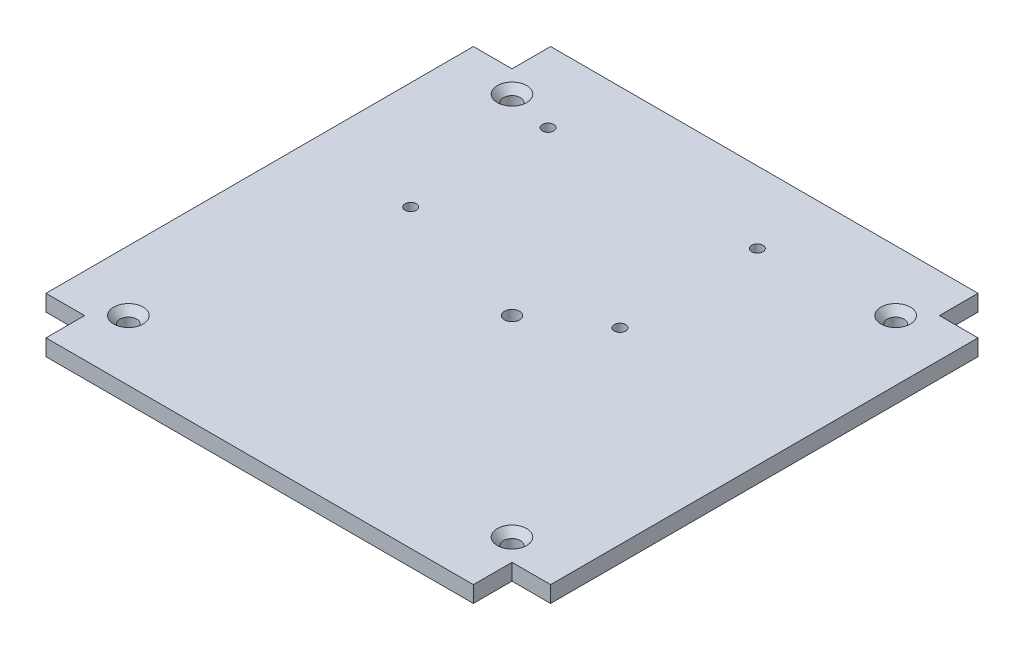
ISO-10303-21;
HEADER;
FILE_DESCRIPTION(('STEP AP214'),'2;1');
FILE_NAME('part.step','',(''),(''),'','','');
FILE_SCHEMA(('AUTOMOTIVE_DESIGN { 1 0 10303 214 1 1 1 1 }'));
ENDSEC;
DATA;
#1=APPLICATION_CONTEXT('core data for automotive mechanical design processes');
#2=APPLICATION_PROTOCOL_DEFINITION('international standard','automotive_design',2000,#1);
#3=PRODUCT_CONTEXT('',#1,'mechanical');
#4=PRODUCT('Part','Part','',(#3));
#5=PRODUCT_RELATED_PRODUCT_CATEGORY('part','',(#4));
#6=PRODUCT_DEFINITION_FORMATION('','',#4);
#7=PRODUCT_DEFINITION_CONTEXT('part definition',#1,'design');
#8=PRODUCT_DEFINITION('design','',#6,#7);
#9=PRODUCT_DEFINITION_SHAPE('','',#8);
#10=(LENGTH_UNIT() NAMED_UNIT(*) SI_UNIT(.MILLI.,.METRE.));
#11=(NAMED_UNIT(*) PLANE_ANGLE_UNIT() SI_UNIT($,.RADIAN.));
#12=(NAMED_UNIT(*) SI_UNIT($,.STERADIAN.) SOLID_ANGLE_UNIT());
#13=UNCERTAINTY_MEASURE_WITH_UNIT(LENGTH_MEASURE(1.E-05),#10,'distance_accuracy_value','');
#14=(GEOMETRIC_REPRESENTATION_CONTEXT(3) GLOBAL_UNCERTAINTY_ASSIGNED_CONTEXT((#13)) GLOBAL_UNIT_ASSIGNED_CONTEXT((#10,
#11,#12)) REPRESENTATION_CONTEXT('',''));
#15=CARTESIAN_POINT('',(0.,0.,0.));
#16=DIRECTION('',(0.,0.,1.));
#17=DIRECTION('',(1.,0.,0.));
#18=AXIS2_PLACEMENT_3D('',#15,#16,#17);
#19=CARTESIAN_POINT('',(49.,3.175,49.));
#20=DIRECTION('',(-1.,0.,0.));
#21=DIRECTION('',(0.,0.,1.));
#22=AXIS2_PLACEMENT_3D('',#19,#20,#21);
#23=PLANE('',#22);
#24=DIRECTION('',(0.,0.,-1.));
#25=VECTOR('',#24,1.);
#26=CARTESIAN_POINT('',(49.,3.175,49.));
#27=LINE('',#26,#25);
#28=CARTESIAN_POINT('',(49.,3.175,41.5));
#29=VERTEX_POINT('',#28);
#30=CARTESIAN_POINT('',(49.,3.175,-41.5));
#31=VERTEX_POINT('',#30);
#32=EDGE_CURVE('E161',#29,#31,#27,.T.);
#33=ORIENTED_EDGE('',*,*,#32,.F.);
#34=DIRECTION('',(0.,1.,0.));
#35=VECTOR('',#34,1.);
#36=CARTESIAN_POINT('',(49.,0.,41.5));
#37=LINE('',#36,#35);
#38=CARTESIAN_POINT('',(49.,0.,41.5));
#39=VERTEX_POINT('',#38);
#40=EDGE_CURVE('E235',#39,#29,#37,.T.);
#41=ORIENTED_EDGE('',*,*,#40,.F.);
#42=DIRECTION('',(0.,0.,-1.));
#43=VECTOR('',#42,1.);
#44=CARTESIAN_POINT('',(49.,0.,49.));
#45=LINE('',#44,#43);
#46=CARTESIAN_POINT('',(49.,0.,-41.5));
#47=VERTEX_POINT('',#46);
#48=EDGE_CURVE('E177',#39,#47,#45,.T.);
#49=ORIENTED_EDGE('',*,*,#48,.T.);
#50=DIRECTION('',(0.,1.,0.));
#51=VECTOR('',#50,1.);
#52=CARTESIAN_POINT('',(49.,0.,-41.5));
#53=LINE('',#52,#51);
#54=EDGE_CURVE('E209',#47,#31,#53,.T.);
#55=ORIENTED_EDGE('',*,*,#54,.T.);
#56=EDGE_LOOP('',(#33,#41,#49,#55));
#57=FACE_BOUND('',#56,.T.);
#58=ADVANCED_FACE('F41',(#57),#23,.F.);
#59=CARTESIAN_POINT('',(-49.,3.175,-49.));
#60=DIRECTION('',(0.,0.,1.));
#61=DIRECTION('',(1.,0.,0.));
#62=AXIS2_PLACEMENT_3D('',#59,#60,#61);
#63=PLANE('',#62);
#64=DIRECTION('',(-1.,0.,0.));
#65=VECTOR('',#64,1.);
#66=CARTESIAN_POINT('',(-49.,3.175,-49.));
#67=LINE('',#66,#65);
#68=CARTESIAN_POINT('',(41.5,3.175,-49.));
#69=VERTEX_POINT('',#68);
#70=CARTESIAN_POINT('',(-41.5,3.175,-49.));
#71=VERTEX_POINT('',#70);
#72=EDGE_CURVE('E165',#69,#71,#67,.T.);
#73=ORIENTED_EDGE('',*,*,#72,.F.);
#74=DIRECTION('',(0.,1.,0.));
#75=VECTOR('',#74,1.);
#76=CARTESIAN_POINT('',(41.5,0.,-49.));
#77=LINE('',#76,#75);
#78=CARTESIAN_POINT('',(41.5,0.,-49.));
#79=VERTEX_POINT('',#78);
#80=EDGE_CURVE('E201',#79,#69,#77,.T.);
#81=ORIENTED_EDGE('',*,*,#80,.F.);
#82=DIRECTION('',(-1.,0.,0.));
#83=VECTOR('',#82,1.);
#84=CARTESIAN_POINT('',(-49.,0.,-49.));
#85=LINE('',#84,#83);
#86=CARTESIAN_POINT('',(-41.5,0.,-49.));
#87=VERTEX_POINT('',#86);
#88=EDGE_CURVE('E169',#79,#87,#85,.T.);
#89=ORIENTED_EDGE('',*,*,#88,.T.);
#90=DIRECTION('',(0.,1.,0.));
#91=VECTOR('',#90,1.);
#92=CARTESIAN_POINT('',(-41.5,0.,-49.));
#93=LINE('',#92,#91);
#94=EDGE_CURVE('E181',#87,#71,#93,.T.);
#95=ORIENTED_EDGE('',*,*,#94,.T.);
#96=EDGE_LOOP('',(#73,#81,#89,#95));
#97=FACE_BOUND('',#96,.T.);
#98=ADVANCED_FACE('F376',(#97),#63,.F.);
#99=CARTESIAN_POINT('',(-49.,3.175,49.));
#100=DIRECTION('',(1.,0.,0.));
#101=DIRECTION('',(0.,0.,-1.));
#102=AXIS2_PLACEMENT_3D('',#99,#100,#101);
#103=PLANE('',#102);
#104=DIRECTION('',(0.,0.,1.));
#105=VECTOR('',#104,1.);
#106=CARTESIAN_POINT('',(-49.,0.,49.));
#107=LINE('',#106,#105);
#108=CARTESIAN_POINT('',(-49.,0.,-41.5));
#109=VERTEX_POINT('',#108);
#110=CARTESIAN_POINT('',(-49.,0.,41.5));
#111=VERTEX_POINT('',#110);
#112=EDGE_CURVE('E162',#109,#111,#107,.T.);
#113=ORIENTED_EDGE('',*,*,#112,.T.);
#114=DIRECTION('',(0.,1.,0.));
#115=VECTOR('',#114,1.);
#116=CARTESIAN_POINT('',(-49.,0.,41.5));
#117=LINE('',#116,#115);
#118=CARTESIAN_POINT('',(-49.,3.175,41.5));
#119=VERTEX_POINT('',#118);
#120=EDGE_CURVE('E248',#111,#119,#117,.T.);
#121=ORIENTED_EDGE('',*,*,#120,.T.);
#122=DIRECTION('',(0.,0.,1.));
#123=VECTOR('',#122,1.);
#124=CARTESIAN_POINT('',(-49.,3.175,49.));
#125=LINE('',#124,#123);
#126=CARTESIAN_POINT('',(-49.,3.175,-41.5));
#127=VERTEX_POINT('',#126);
#128=EDGE_CURVE('E50',#127,#119,#125,.T.);
#129=ORIENTED_EDGE('',*,*,#128,.F.);
#130=DIRECTION('',(0.,1.,0.));
#131=VECTOR('',#130,1.);
#132=CARTESIAN_POINT('',(-49.,0.,-41.5));
#133=LINE('',#132,#131);
#134=EDGE_CURVE('E187',#109,#127,#133,.T.);
#135=ORIENTED_EDGE('',*,*,#134,.F.);
#136=EDGE_LOOP('',(#113,#121,#129,#135));
#137=FACE_BOUND('',#136,.T.);
#138=ADVANCED_FACE('F365',(#137),#103,.F.);
#139=CARTESIAN_POINT('',(-49.,3.175,49.));
#140=DIRECTION('',(0.,0.,-1.));
#141=DIRECTION('',(-1.,0.,0.));
#142=AXIS2_PLACEMENT_3D('',#139,#140,#141);
#143=PLANE('',#142);
#144=DIRECTION('',(1.,0.,0.));
#145=VECTOR('',#144,1.);
#146=CARTESIAN_POINT('',(-49.,3.175,49.));
#147=LINE('',#146,#145);
#148=CARTESIAN_POINT('',(-41.5,3.175,49.));
#149=VERTEX_POINT('',#148);
#150=CARTESIAN_POINT('',(41.5,3.175,49.));
#151=VERTEX_POINT('',#150);
#152=EDGE_CURVE('E11',#149,#151,#147,.T.);
#153=ORIENTED_EDGE('',*,*,#152,.F.);
#154=DIRECTION('',(0.,1.,0.));
#155=VECTOR('',#154,1.);
#156=CARTESIAN_POINT('',(-41.5,0.,49.));
#157=LINE('',#156,#155);
#158=CARTESIAN_POINT('',(-41.5,0.,49.));
#159=VERTEX_POINT('',#158);
#160=EDGE_CURVE('E146',#159,#149,#157,.T.);
#161=ORIENTED_EDGE('',*,*,#160,.F.);
#162=DIRECTION('',(1.,0.,0.));
#163=VECTOR('',#162,1.);
#164=CARTESIAN_POINT('',(-49.,0.,49.));
#165=LINE('',#164,#163);
#166=CARTESIAN_POINT('',(41.5,0.,49.));
#167=VERTEX_POINT('',#166);
#168=EDGE_CURVE('E44',#159,#167,#165,.T.);
#169=ORIENTED_EDGE('',*,*,#168,.T.);
#170=DIRECTION('',(0.,1.,0.));
#171=VECTOR('',#170,1.);
#172=CARTESIAN_POINT('',(41.5,0.,49.));
#173=LINE('',#172,#171);
#174=EDGE_CURVE('E232',#167,#151,#173,.T.);
#175=ORIENTED_EDGE('',*,*,#174,.T.);
#176=EDGE_LOOP('',(#153,#161,#169,#175));
#177=FACE_BOUND('',#176,.T.);
#178=ADVANCED_FACE('F155',(#177),#143,.F.);
#179=CARTESIAN_POINT('',(0.,3.175,0.));
#180=DIRECTION('',(0.,-1.,0.));
#181=DIRECTION('',(0.,0.,-1.));
#182=AXIS2_PLACEMENT_3D('',#179,#180,#181);
#183=PLANE('',#182);
#184=CARTESIAN_POINT('',(37.2500000000016,3.175,37.250000000002));
#185=DIRECTION('',(0.,1.,0.));
#186=DIRECTION('',(0.,0.,1.));
#187=AXIS2_PLACEMENT_3D('',#184,#185,#186);
#188=CIRCLE('',#187,2.8575);
#189=CARTESIAN_POINT('',(37.2500000000016,3.175,40.107500000002));
#190=VERTEX_POINT('',#189);
#191=EDGE_CURVE('E334',#190,#190,#188,.T.);
#192=ORIENTED_EDGE('',*,*,#191,.F.);
#193=EDGE_LOOP('',(#192));
#194=FACE_BOUND('',#193,.T.);
#195=CARTESIAN_POINT('',(-37.2499999999981,3.175,37.2500000000024));
#196=DIRECTION('',(0.,1.,0.));
#197=DIRECTION('',(0.,0.,1.));
#198=AXIS2_PLACEMENT_3D('',#195,#196,#197);
#199=CIRCLE('',#198,2.8575);
#200=CARTESIAN_POINT('',(-37.2499999999981,3.175,40.1075000000024));
#201=VERTEX_POINT('',#200);
#202=EDGE_CURVE('E324',#201,#201,#199,.T.);
#203=ORIENTED_EDGE('',*,*,#202,.F.);
#204=EDGE_LOOP('',(#203));
#205=FACE_BOUND('',#204,.T.);
#206=CARTESIAN_POINT('',(-37.2499999999987,3.175,-37.2499999999978));
#207=DIRECTION('',(0.,1.,0.));
#208=DIRECTION('',(0.,0.,1.));
#209=AXIS2_PLACEMENT_3D('',#206,#207,#208);
#210=CIRCLE('',#209,2.8575);
#211=CARTESIAN_POINT('',(-37.2499999999987,3.175,-34.3924999999978));
#212=VERTEX_POINT('',#211);
#213=EDGE_CURVE('E315',#212,#212,#210,.T.);
#214=ORIENTED_EDGE('',*,*,#213,.F.);
#215=EDGE_LOOP('',(#214));
#216=FACE_BOUND('',#215,.T.);
#217=CARTESIAN_POINT('',(37.2499999999997,3.175,-37.2499999999999));
#218=DIRECTION('',(0.,1.,0.));
#219=DIRECTION('',(0.,0.,1.));
#220=AXIS2_PLACEMENT_3D('',#217,#218,#219);
#221=CIRCLE('',#220,2.8575);
#222=CARTESIAN_POINT('',(37.2499999999997,3.175,-34.3924999999999));
#223=VERTEX_POINT('',#222);
#224=EDGE_CURVE('E305',#223,#223,#221,.T.);
#225=ORIENTED_EDGE('',*,*,#224,.F.);
#226=EDGE_LOOP('',(#225));
#227=FACE_BOUND('',#226,.T.);
#228=CARTESIAN_POINT('',(-28.095,3.175,-35.095));
#229=DIRECTION('',(0.,1.,0.));
#230=DIRECTION('',(0.,0.,1.));
#231=AXIS2_PLACEMENT_3D('',#228,#229,#230);
#232=CIRCLE('',#231,1.1);
#233=CARTESIAN_POINT('',(-28.095,3.175,-33.995));
#234=VERTEX_POINT('',#233);
#235=EDGE_CURVE('E294',#234,#234,#232,.T.);
#236=ORIENTED_EDGE('',*,*,#235,.F.);
#237=EDGE_LOOP('',(#236));
#238=FACE_BOUND('',#237,.T.);
#239=CARTESIAN_POINT('',(12.545,3.175,-35.095));
#240=DIRECTION('',(0.,1.,0.));
#241=DIRECTION('',(0.,0.,1.));
#242=AXIS2_PLACEMENT_3D('',#239,#240,#241);
#243=CIRCLE('',#242,1.1);
#244=CARTESIAN_POINT('',(12.545,3.175,-33.995));
#245=VERTEX_POINT('',#244);
#246=EDGE_CURVE('E287',#245,#245,#243,.T.);
#247=ORIENTED_EDGE('',*,*,#246,.F.);
#248=EDGE_LOOP('',(#247));
#249=FACE_BOUND('',#248,.T.);
#250=CARTESIAN_POINT('',(12.545,3.175,-8.425));
#251=DIRECTION('',(0.,1.,0.));
#252=DIRECTION('',(0.,0.,1.));
#253=AXIS2_PLACEMENT_3D('',#250,#251,#252);
#254=CIRCLE('',#253,1.1);
#255=CARTESIAN_POINT('',(12.545,3.175,-7.325));
#256=VERTEX_POINT('',#255);
#257=EDGE_CURVE('E279',#256,#256,#254,.T.);
#258=ORIENTED_EDGE('',*,*,#257,.F.);
#259=EDGE_LOOP('',(#258));
#260=FACE_BOUND('',#259,.T.);
#261=CARTESIAN_POINT('',(-28.095,3.175,-8.425));
#262=DIRECTION('',(0.,1.,0.));
#263=DIRECTION('',(0.,0.,1.));
#264=AXIS2_PLACEMENT_3D('',#261,#262,#263);
#265=CIRCLE('',#264,1.1);
#266=CARTESIAN_POINT('',(-28.095,3.175,-7.325));
#267=VERTEX_POINT('',#266);
#268=EDGE_CURVE('E271',#267,#267,#265,.T.);
#269=ORIENTED_EDGE('',*,*,#268,.F.);
#270=EDGE_LOOP('',(#269));
#271=FACE_BOUND('',#270,.T.);
#272=CARTESIAN_POINT('',(0.,3.175,0.));
#273=DIRECTION('',(0.,1.,0.));
#274=DIRECTION('',(0.,0.,1.));
#275=AXIS2_PLACEMENT_3D('',#272,#273,#274);
#276=CIRCLE('',#275,1.47319999999999);
#277=CARTESIAN_POINT('',(0.,3.175,1.47319999999999));
#278=VERTEX_POINT('',#277);
#279=EDGE_CURVE('E263',#278,#278,#276,.T.);
#280=ORIENTED_EDGE('',*,*,#279,.F.);
#281=EDGE_LOOP('',(#280));
#282=FACE_BOUND('',#281,.T.);
#283=ORIENTED_EDGE('',*,*,#128,.T.);
#284=DIRECTION('',(-1.,0.,0.));
#285=VECTOR('',#284,1.);
#286=CARTESIAN_POINT('',(-49.,3.175,41.5));
#287=LINE('',#286,#285);
#288=CARTESIAN_POINT('',(-41.5,3.175,41.5));
#289=VERTEX_POINT('',#288);
#290=EDGE_CURVE('E151',#289,#119,#287,.T.);
#291=ORIENTED_EDGE('',*,*,#290,.F.);
#292=DIRECTION('',(0.,0.,-1.));
#293=VECTOR('',#292,1.);
#294=CARTESIAN_POINT('',(-41.5,3.175,41.5));
#295=LINE('',#294,#293);
#296=EDGE_CURVE('E256',#149,#289,#295,.T.);
#297=ORIENTED_EDGE('',*,*,#296,.F.);
#298=ORIENTED_EDGE('',*,*,#152,.T.);
#299=DIRECTION('',(0.,0.,1.));
#300=VECTOR('',#299,1.);
#301=CARTESIAN_POINT('',(41.5,3.175,41.5));
#302=LINE('',#301,#300);
#303=CARTESIAN_POINT('',(41.5,3.175,41.5));
#304=VERTEX_POINT('',#303);
#305=EDGE_CURVE('E244',#304,#151,#302,.T.);
#306=ORIENTED_EDGE('',*,*,#305,.F.);
#307=DIRECTION('',(-1.,0.,0.));
#308=VECTOR('',#307,1.);
#309=CARTESIAN_POINT('',(41.5,3.175,41.5));
#310=LINE('',#309,#308);
#311=EDGE_CURVE('E240',#29,#304,#310,.T.);
#312=ORIENTED_EDGE('',*,*,#311,.F.);
#313=ORIENTED_EDGE('',*,*,#32,.T.);
#314=DIRECTION('',(1.,0.,0.));
#315=VECTOR('',#314,1.);
#316=CARTESIAN_POINT('',(41.5,3.175,-41.5));
#317=LINE('',#316,#315);
#318=CARTESIAN_POINT('',(41.5,3.175,-41.5));
#319=VERTEX_POINT('',#318);
#320=EDGE_CURVE('E216',#319,#31,#317,.T.);
#321=ORIENTED_EDGE('',*,*,#320,.F.);
#322=DIRECTION('',(0.,0.,1.));
#323=VECTOR('',#322,1.);
#324=CARTESIAN_POINT('',(41.5,3.175,-49.));
#325=LINE('',#324,#323);
#326=EDGE_CURVE('E221',#69,#319,#325,.T.);
#327=ORIENTED_EDGE('',*,*,#326,.F.);
#328=ORIENTED_EDGE('',*,*,#72,.T.);
#329=DIRECTION('',(0.,0.,-1.));
#330=VECTOR('',#329,1.);
#331=CARTESIAN_POINT('',(-41.5,3.175,-49.));
#332=LINE('',#331,#330);
#333=CARTESIAN_POINT('',(-41.5,3.175,-41.5));
#334=VERTEX_POINT('',#333);
#335=EDGE_CURVE('E194',#334,#71,#332,.T.);
#336=ORIENTED_EDGE('',*,*,#335,.F.);
#337=DIRECTION('',(1.,0.,0.));
#338=VECTOR('',#337,1.);
#339=CARTESIAN_POINT('',(-49.,3.175,-41.5));
#340=LINE('',#339,#338);
#341=EDGE_CURVE('E198',#127,#334,#340,.T.);
#342=ORIENTED_EDGE('',*,*,#341,.F.);
#343=EDGE_LOOP('',(#283,#291,#297,#298,#306,#312,#313,#321,#327,#328,#336,#342));
#344=FACE_BOUND('',#343,.T.);
#345=ADVANCED_FACE('F341',(#194,#205,#216,#227,#238,#249,#260,#271,#282,#344),#183,.F.);
#346=CARTESIAN_POINT('',(0.,0.,0.));
#347=DIRECTION('',(0.,-1.,0.));
#348=DIRECTION('',(0.,0.,-1.));
#349=AXIS2_PLACEMENT_3D('',#346,#347,#348);
#350=PLANE('',#349);
#351=CARTESIAN_POINT('',(37.2500000000016,0.,37.250000000002));
#352=DIRECTION('',(0.,1.,0.));
#353=DIRECTION('',(0.,0.,1.));
#354=AXIS2_PLACEMENT_3D('',#351,#352,#353);
#355=CIRCLE('',#354,1.63195);
#356=CARTESIAN_POINT('',(37.2500000000016,0.,38.881950000002));
#357=VERTEX_POINT('',#356);
#358=EDGE_CURVE('E327',#357,#357,#355,.T.);
#359=ORIENTED_EDGE('',*,*,#358,.T.);
#360=EDGE_LOOP('',(#359));
#361=FACE_BOUND('',#360,.T.);
#362=CARTESIAN_POINT('',(-37.2499999999981,0.,37.2500000000024));
#363=DIRECTION('',(0.,1.,0.));
#364=DIRECTION('',(0.,0.,1.));
#365=AXIS2_PLACEMENT_3D('',#362,#363,#364);
#366=CIRCLE('',#365,1.63195);
#367=CARTESIAN_POINT('',(-37.2499999999981,0.,38.8819500000024));
#368=VERTEX_POINT('',#367);
#369=EDGE_CURVE('E318',#368,#368,#366,.T.);
#370=ORIENTED_EDGE('',*,*,#369,.T.);
#371=EDGE_LOOP('',(#370));
#372=FACE_BOUND('',#371,.T.);
#373=CARTESIAN_POINT('',(-37.2499999999987,0.,-37.2499999999978));
#374=DIRECTION('',(0.,1.,0.));
#375=DIRECTION('',(0.,0.,1.));
#376=AXIS2_PLACEMENT_3D('',#373,#374,#375);
#377=CIRCLE('',#376,1.63195);
#378=CARTESIAN_POINT('',(-37.2499999999987,0.,-35.6180499999978));
#379=VERTEX_POINT('',#378);
#380=EDGE_CURVE('E309',#379,#379,#377,.T.);
#381=ORIENTED_EDGE('',*,*,#380,.T.);
#382=EDGE_LOOP('',(#381));
#383=FACE_BOUND('',#382,.T.);
#384=CARTESIAN_POINT('',(37.2499999999997,0.,-37.2499999999999));
#385=DIRECTION('',(0.,1.,0.));
#386=DIRECTION('',(0.,0.,1.));
#387=AXIS2_PLACEMENT_3D('',#384,#385,#386);
#388=CIRCLE('',#387,1.63195);
#389=CARTESIAN_POINT('',(37.2499999999997,0.,-35.6180499999999));
#390=VERTEX_POINT('',#389);
#391=EDGE_CURVE('E297',#390,#390,#388,.T.);
#392=ORIENTED_EDGE('',*,*,#391,.T.);
#393=EDGE_LOOP('',(#392));
#394=FACE_BOUND('',#393,.T.);
#395=CARTESIAN_POINT('',(-28.095,0.,-35.095));
#396=DIRECTION('',(0.,1.,0.));
#397=DIRECTION('',(0.,0.,1.));
#398=AXIS2_PLACEMENT_3D('',#395,#396,#397);
#399=CIRCLE('',#398,1.1);
#400=CARTESIAN_POINT('',(-28.095,0.,-33.995));
#401=VERTEX_POINT('',#400);
#402=EDGE_CURVE('E291',#401,#401,#399,.T.);
#403=ORIENTED_EDGE('',*,*,#402,.T.);
#404=EDGE_LOOP('',(#403));
#405=FACE_BOUND('',#404,.T.);
#406=CARTESIAN_POINT('',(12.545,0.,-35.095));
#407=DIRECTION('',(0.,1.,0.));
#408=DIRECTION('',(0.,0.,1.));
#409=AXIS2_PLACEMENT_3D('',#406,#407,#408);
#410=CIRCLE('',#409,1.1);
#411=CARTESIAN_POINT('',(12.545,0.,-33.995));
#412=VERTEX_POINT('',#411);
#413=EDGE_CURVE('E283',#412,#412,#410,.T.);
#414=ORIENTED_EDGE('',*,*,#413,.T.);
#415=EDGE_LOOP('',(#414));
#416=FACE_BOUND('',#415,.T.);
#417=CARTESIAN_POINT('',(12.545,0.,-8.425));
#418=DIRECTION('',(0.,1.,0.));
#419=DIRECTION('',(0.,0.,1.));
#420=AXIS2_PLACEMENT_3D('',#417,#418,#419);
#421=CIRCLE('',#420,1.1);
#422=CARTESIAN_POINT('',(12.545,0.,-7.325));
#423=VERTEX_POINT('',#422);
#424=EDGE_CURVE('E275',#423,#423,#421,.T.);
#425=ORIENTED_EDGE('',*,*,#424,.T.);
#426=EDGE_LOOP('',(#425));
#427=FACE_BOUND('',#426,.T.);
#428=CARTESIAN_POINT('',(-28.095,0.,-8.425));
#429=DIRECTION('',(0.,1.,0.));
#430=DIRECTION('',(0.,0.,1.));
#431=AXIS2_PLACEMENT_3D('',#428,#429,#430);
#432=CIRCLE('',#431,1.1);
#433=CARTESIAN_POINT('',(-28.095,0.,-7.325));
#434=VERTEX_POINT('',#433);
#435=EDGE_CURVE('E267',#434,#434,#432,.T.);
#436=ORIENTED_EDGE('',*,*,#435,.T.);
#437=EDGE_LOOP('',(#436));
#438=FACE_BOUND('',#437,.T.);
#439=CARTESIAN_POINT('',(0.,0.,0.));
#440=DIRECTION('',(0.,1.,0.));
#441=DIRECTION('',(0.,0.,1.));
#442=AXIS2_PLACEMENT_3D('',#439,#440,#441);
#443=CIRCLE('',#442,1.4732);
#444=CARTESIAN_POINT('',(0.,0.,1.4732));
#445=VERTEX_POINT('',#444);
#446=EDGE_CURVE('E258',#445,#445,#443,.T.);
#447=ORIENTED_EDGE('',*,*,#446,.T.);
#448=EDGE_LOOP('',(#447));
#449=FACE_BOUND('',#448,.T.);
#450=DIRECTION('',(-1.,0.,0.));
#451=VECTOR('',#450,1.);
#452=CARTESIAN_POINT('',(-49.,0.,41.5));
#453=LINE('',#452,#451);
#454=CARTESIAN_POINT('',(-41.5,0.,41.5));
#455=VERTEX_POINT('',#454);
#456=EDGE_CURVE('E58',#455,#111,#453,.T.);
#457=ORIENTED_EDGE('',*,*,#456,.T.);
#458=ORIENTED_EDGE('',*,*,#112,.F.);
#459=DIRECTION('',(1.,0.,0.));
#460=VECTOR('',#459,1.);
#461=CARTESIAN_POINT('',(-49.,0.,-41.5));
#462=LINE('',#461,#460);
#463=CARTESIAN_POINT('',(-41.5,0.,-41.5));
#464=VERTEX_POINT('',#463);
#465=EDGE_CURVE('E197',#109,#464,#462,.T.);
#466=ORIENTED_EDGE('',*,*,#465,.T.);
#467=DIRECTION('',(0.,0.,-1.));
#468=VECTOR('',#467,1.);
#469=CARTESIAN_POINT('',(-41.5,0.,-49.));
#470=LINE('',#469,#468);
#471=EDGE_CURVE('E190',#464,#87,#470,.T.);
#472=ORIENTED_EDGE('',*,*,#471,.T.);
#473=ORIENTED_EDGE('',*,*,#88,.F.);
#474=DIRECTION('',(0.,0.,1.));
#475=VECTOR('',#474,1.);
#476=CARTESIAN_POINT('',(41.5,0.,-49.));
#477=LINE('',#476,#475);
#478=CARTESIAN_POINT('',(41.5,0.,-41.5));
#479=VERTEX_POINT('',#478);
#480=EDGE_CURVE('E220',#79,#479,#477,.T.);
#481=ORIENTED_EDGE('',*,*,#480,.T.);
#482=DIRECTION('',(1.,0.,0.));
#483=VECTOR('',#482,1.);
#484=CARTESIAN_POINT('',(41.5,0.,-41.5));
#485=LINE('',#484,#483);
#486=EDGE_CURVE('E210',#479,#47,#485,.T.);
#487=ORIENTED_EDGE('',*,*,#486,.T.);
#488=ORIENTED_EDGE('',*,*,#48,.F.);
#489=DIRECTION('',(-1.,0.,0.));
#490=VECTOR('',#489,1.);
#491=CARTESIAN_POINT('',(41.5,0.,41.5));
#492=LINE('',#491,#490);
#493=CARTESIAN_POINT('',(41.5,0.,41.5));
#494=VERTEX_POINT('',#493);
#495=EDGE_CURVE('E236',#39,#494,#492,.T.);
#496=ORIENTED_EDGE('',*,*,#495,.T.);
#497=DIRECTION('',(0.,0.,1.));
#498=VECTOR('',#497,1.);
#499=CARTESIAN_POINT('',(41.5,0.,41.5));
#500=LINE('',#499,#498);
#501=EDGE_CURVE('E69',#494,#167,#500,.T.);
#502=ORIENTED_EDGE('',*,*,#501,.T.);
#503=ORIENTED_EDGE('',*,*,#168,.F.);
#504=DIRECTION('',(0.,0.,-1.));
#505=VECTOR('',#504,1.);
#506=CARTESIAN_POINT('',(-41.5,0.,41.5));
#507=LINE('',#506,#505);
#508=EDGE_CURVE('E142',#159,#455,#507,.T.);
#509=ORIENTED_EDGE('',*,*,#508,.T.);
#510=EDGE_LOOP('',(#457,#458,#466,#472,#473,#481,#487,#488,#496,#502,#503,#509));
#511=FACE_BOUND('',#510,.T.);
#512=ADVANCED_FACE('F158',(#361,#372,#383,#394,#405,#416,#427,#438,#449,#511),#350,.T.);
#513=CARTESIAN_POINT('',(-41.5,0.,-49.));
#514=DIRECTION('',(1.,0.,0.));
#515=DIRECTION('',(0.,0.,-1.));
#516=AXIS2_PLACEMENT_3D('',#513,#514,#515);
#517=PLANE('',#516);
#518=ORIENTED_EDGE('',*,*,#335,.T.);
#519=ORIENTED_EDGE('',*,*,#94,.F.);
#520=ORIENTED_EDGE('',*,*,#471,.F.);
#521=DIRECTION('',(0.,1.,0.));
#522=VECTOR('',#521,1.);
#523=CARTESIAN_POINT('',(-41.5,0.,-41.5));
#524=LINE('',#523,#522);
#525=EDGE_CURVE('E189',#464,#334,#524,.T.);
#526=ORIENTED_EDGE('',*,*,#525,.T.);
#527=EDGE_LOOP('',(#518,#519,#520,#526));
#528=FACE_BOUND('',#527,.T.);
#529=ADVANCED_FACE('F372',(#528),#517,.F.);
#530=CARTESIAN_POINT('',(-49.,0.,-41.5));
#531=DIRECTION('',(0.,0.,1.));
#532=DIRECTION('',(1.,0.,0.));
#533=AXIS2_PLACEMENT_3D('',#530,#531,#532);
#534=PLANE('',#533);
#535=ORIENTED_EDGE('',*,*,#341,.T.);
#536=ORIENTED_EDGE('',*,*,#525,.F.);
#537=ORIENTED_EDGE('',*,*,#465,.F.);
#538=ORIENTED_EDGE('',*,*,#134,.T.);
#539=EDGE_LOOP('',(#535,#536,#537,#538));
#540=FACE_BOUND('',#539,.T.);
#541=ADVANCED_FACE('F370',(#540),#534,.F.);
#542=CARTESIAN_POINT('',(41.5,0.,-49.));
#543=DIRECTION('',(-1.,0.,0.));
#544=DIRECTION('',(0.,0.,1.));
#545=AXIS2_PLACEMENT_3D('',#542,#543,#544);
#546=PLANE('',#545);
#547=ORIENTED_EDGE('',*,*,#326,.T.);
#548=DIRECTION('',(0.,1.,0.));
#549=VECTOR('',#548,1.);
#550=CARTESIAN_POINT('',(41.5,0.,-41.5));
#551=LINE('',#550,#549);
#552=EDGE_CURVE('E206',#479,#319,#551,.T.);
#553=ORIENTED_EDGE('',*,*,#552,.F.);
#554=ORIENTED_EDGE('',*,*,#480,.F.);
#555=ORIENTED_EDGE('',*,*,#80,.T.);
#556=EDGE_LOOP('',(#547,#553,#554,#555));
#557=FACE_BOUND('',#556,.T.);
#558=ADVANCED_FACE('F381',(#557),#546,.F.);
#559=CARTESIAN_POINT('',(41.5,0.,-41.5));
#560=DIRECTION('',(0.,0.,1.));
#561=DIRECTION('',(1.,0.,0.));
#562=AXIS2_PLACEMENT_3D('',#559,#560,#561);
#563=PLANE('',#562);
#564=ORIENTED_EDGE('',*,*,#320,.T.);
#565=ORIENTED_EDGE('',*,*,#54,.F.);
#566=ORIENTED_EDGE('',*,*,#486,.F.);
#567=ORIENTED_EDGE('',*,*,#552,.T.);
#568=EDGE_LOOP('',(#564,#565,#566,#567));
#569=FACE_BOUND('',#568,.T.);
#570=ADVANCED_FACE('F386',(#569),#563,.F.);
#571=CARTESIAN_POINT('',(41.5,0.,41.5));
#572=DIRECTION('',(-1.,0.,0.));
#573=DIRECTION('',(0.,0.,1.));
#574=AXIS2_PLACEMENT_3D('',#571,#572,#573);
#575=PLANE('',#574);
#576=ORIENTED_EDGE('',*,*,#305,.T.);
#577=ORIENTED_EDGE('',*,*,#174,.F.);
#578=ORIENTED_EDGE('',*,*,#501,.F.);
#579=DIRECTION('',(0.,1.,0.));
#580=VECTOR('',#579,1.);
#581=CARTESIAN_POINT('',(41.5,0.,41.5));
#582=LINE('',#581,#580);
#583=EDGE_CURVE('E225',#494,#304,#582,.T.);
#584=ORIENTED_EDGE('',*,*,#583,.T.);
#585=EDGE_LOOP('',(#576,#577,#578,#584));
#586=FACE_BOUND('',#585,.T.);
#587=ADVANCED_FACE('F394',(#586),#575,.F.);
#588=CARTESIAN_POINT('',(41.5,0.,41.5));
#589=DIRECTION('',(0.,0.,-1.));
#590=DIRECTION('',(-1.,0.,0.));
#591=AXIS2_PLACEMENT_3D('',#588,#589,#590);
#592=PLANE('',#591);
#593=ORIENTED_EDGE('',*,*,#311,.T.);
#594=ORIENTED_EDGE('',*,*,#583,.F.);
#595=ORIENTED_EDGE('',*,*,#495,.F.);
#596=ORIENTED_EDGE('',*,*,#40,.T.);
#597=EDGE_LOOP('',(#593,#594,#595,#596));
#598=FACE_BOUND('',#597,.T.);
#599=ADVANCED_FACE('F391',(#598),#592,.F.);
#600=CARTESIAN_POINT('',(-49.,0.,41.5));
#601=DIRECTION('',(0.,0.,-1.));
#602=DIRECTION('',(-1.,0.,0.));
#603=AXIS2_PLACEMENT_3D('',#600,#601,#602);
#604=PLANE('',#603);
#605=ORIENTED_EDGE('',*,*,#290,.T.);
#606=ORIENTED_EDGE('',*,*,#120,.F.);
#607=ORIENTED_EDGE('',*,*,#456,.F.);
#608=DIRECTION('',(0.,1.,0.));
#609=VECTOR('',#608,1.);
#610=CARTESIAN_POINT('',(-41.5,0.,41.5));
#611=LINE('',#610,#609);
#612=EDGE_CURVE('E148',#455,#289,#611,.T.);
#613=ORIENTED_EDGE('',*,*,#612,.T.);
#614=EDGE_LOOP('',(#605,#606,#607,#613));
#615=FACE_BOUND('',#614,.T.);
#616=ADVANCED_FACE('F366',(#615),#604,.F.);
#617=CARTESIAN_POINT('',(-41.5,0.,41.5));
#618=DIRECTION('',(1.,0.,0.));
#619=DIRECTION('',(0.,0.,-1.));
#620=AXIS2_PLACEMENT_3D('',#617,#618,#619);
#621=PLANE('',#620);
#622=ORIENTED_EDGE('',*,*,#296,.T.);
#623=ORIENTED_EDGE('',*,*,#612,.F.);
#624=ORIENTED_EDGE('',*,*,#508,.F.);
#625=ORIENTED_EDGE('',*,*,#160,.T.);
#626=EDGE_LOOP('',(#622,#623,#624,#625));
#627=FACE_BOUND('',#626,.T.);
#628=ADVANCED_FACE('F145',(#627),#621,.F.);
#629=CARTESIAN_POINT('',(0.,3.175,0.));
#630=DIRECTION('',(0.,1.,0.));
#631=DIRECTION('',(0.,0.,1.));
#632=AXIS2_PLACEMENT_3D('',#629,#630,#631);
#633=CYLINDRICAL_SURFACE('',#632,1.47319999999999);
#634=ORIENTED_EDGE('',*,*,#446,.F.);
#635=EDGE_LOOP('',(#634));
#636=FACE_BOUND('',#635,.T.);
#637=ORIENTED_EDGE('',*,*,#279,.T.);
#638=EDGE_LOOP('',(#637));
#639=FACE_BOUND('',#638,.T.);
#640=ADVANCED_FACE('F457',(#636,#639),#633,.F.);
#641=CARTESIAN_POINT('',(-28.095,3.175,-8.425));
#642=DIRECTION('',(0.,1.,0.));
#643=DIRECTION('',(0.,0.,1.));
#644=AXIS2_PLACEMENT_3D('',#641,#642,#643);
#645=CYLINDRICAL_SURFACE('',#644,1.1);
#646=ORIENTED_EDGE('',*,*,#435,.F.);
#647=EDGE_LOOP('',(#646));
#648=FACE_BOUND('',#647,.T.);
#649=ORIENTED_EDGE('',*,*,#268,.T.);
#650=EDGE_LOOP('',(#649));
#651=FACE_BOUND('',#650,.T.);
#652=ADVANCED_FACE('F466',(#648,#651),#645,.F.);
#653=CARTESIAN_POINT('',(12.545,3.175,-8.425));
#654=DIRECTION('',(0.,1.,0.));
#655=DIRECTION('',(0.,0.,1.));
#656=AXIS2_PLACEMENT_3D('',#653,#654,#655);
#657=CYLINDRICAL_SURFACE('',#656,1.1);
#658=ORIENTED_EDGE('',*,*,#424,.F.);
#659=EDGE_LOOP('',(#658));
#660=FACE_BOUND('',#659,.T.);
#661=ORIENTED_EDGE('',*,*,#257,.T.);
#662=EDGE_LOOP('',(#661));
#663=FACE_BOUND('',#662,.T.);
#664=ADVANCED_FACE('F477',(#660,#663),#657,.F.);
#665=CARTESIAN_POINT('',(12.545,3.175,-35.095));
#666=DIRECTION('',(0.,1.,0.));
#667=DIRECTION('',(0.,0.,1.));
#668=AXIS2_PLACEMENT_3D('',#665,#666,#667);
#669=CYLINDRICAL_SURFACE('',#668,1.1);
#670=ORIENTED_EDGE('',*,*,#413,.F.);
#671=EDGE_LOOP('',(#670));
#672=FACE_BOUND('',#671,.T.);
#673=ORIENTED_EDGE('',*,*,#246,.T.);
#674=EDGE_LOOP('',(#673));
#675=FACE_BOUND('',#674,.T.);
#676=ADVANCED_FACE('F486',(#672,#675),#669,.F.);
#677=CARTESIAN_POINT('',(-28.095,3.175,-35.095));
#678=DIRECTION('',(0.,1.,0.));
#679=DIRECTION('',(0.,0.,1.));
#680=AXIS2_PLACEMENT_3D('',#677,#678,#679);
#681=CYLINDRICAL_SURFACE('',#680,1.1);
#682=ORIENTED_EDGE('',*,*,#402,.F.);
#683=EDGE_LOOP('',(#682));
#684=FACE_BOUND('',#683,.T.);
#685=ORIENTED_EDGE('',*,*,#235,.T.);
#686=EDGE_LOOP('',(#685));
#687=FACE_BOUND('',#686,.T.);
#688=ADVANCED_FACE('F495',(#684,#687),#681,.F.);
#689=CARTESIAN_POINT('',(37.2499999999997,3.175,-37.2499999999999));
#690=DIRECTION('',(0.,1.,0.));
#691=DIRECTION('',(0.,0.,1.));
#692=AXIS2_PLACEMENT_3D('',#689,#690,#691);
#693=CYLINDRICAL_SURFACE('',#692,1.63194999999999);
#694=ORIENTED_EDGE('',*,*,#391,.F.);
#695=EDGE_LOOP('',(#694));
#696=FACE_BOUND('',#695,.T.);
#697=CARTESIAN_POINT('',(37.2499999999997,1.76516599853026,-37.2499999999999));
#698=DIRECTION('',(0.,1.,0.));
#699=DIRECTION('',(0.,0.,1.));
#700=AXIS2_PLACEMENT_3D('',#697,#698,#699);
#701=CIRCLE('',#700,1.63194999999999);
#702=CARTESIAN_POINT('',(37.2499999999997,1.76516599853026,-35.6180499999999));
#703=VERTEX_POINT('',#702);
#704=EDGE_CURVE('E301',#703,#703,#701,.T.);
#705=ORIENTED_EDGE('',*,*,#704,.T.);
#706=EDGE_LOOP('',(#705));
#707=FACE_BOUND('',#706,.T.);
#708=ADVANCED_FACE('F505',(#696,#707),#693,.F.);
#709=CARTESIAN_POINT('',(37.2499999999997,3.175,-37.2499999999999));
#710=DIRECTION('',(0.,1.,0.));
#711=DIRECTION('',(0.,0.,1.));
#712=AXIS2_PLACEMENT_3D('',#709,#710,#711);
#713=CONICAL_SURFACE('',#712,2.8575,0.715584993317669);
#714=ORIENTED_EDGE('',*,*,#704,.F.);
#715=EDGE_LOOP('',(#714));
#716=FACE_BOUND('',#715,.T.);
#717=ORIENTED_EDGE('',*,*,#224,.T.);
#718=EDGE_LOOP('',(#717));
#719=FACE_BOUND('',#718,.T.);
#720=ADVANCED_FACE('F526',(#716,#719),#713,.F.);
#721=CARTESIAN_POINT('',(-37.2499999999987,3.175,-37.2499999999978));
#722=DIRECTION('',(0.,1.,0.));
#723=DIRECTION('',(0.,0.,1.));
#724=AXIS2_PLACEMENT_3D('',#721,#722,#723);
#725=CYLINDRICAL_SURFACE('',#724,1.63194999999999);
#726=ORIENTED_EDGE('',*,*,#380,.F.);
#727=EDGE_LOOP('',(#726));
#728=FACE_BOUND('',#727,.T.);
#729=CARTESIAN_POINT('',(-37.2499999999987,1.76516599853026,-37.2499999999978));
#730=DIRECTION('',(0.,1.,0.));
#731=DIRECTION('',(0.,0.,1.));
#732=AXIS2_PLACEMENT_3D('',#729,#730,#731);
#733=CIRCLE('',#732,1.63194999999999);
#734=CARTESIAN_POINT('',(-37.2499999999987,1.76516599853026,-35.6180499999978));
#735=VERTEX_POINT('',#734);
#736=EDGE_CURVE('E312',#735,#735,#733,.T.);
#737=ORIENTED_EDGE('',*,*,#736,.T.);
#738=EDGE_LOOP('',(#737));
#739=FACE_BOUND('',#738,.T.);
#740=ADVANCED_FACE('F536',(#728,#739),#725,.F.);
#741=CARTESIAN_POINT('',(-37.2499999999987,3.175,-37.2499999999978));
#742=DIRECTION('',(0.,1.,0.));
#743=DIRECTION('',(0.,0.,1.));
#744=AXIS2_PLACEMENT_3D('',#741,#742,#743);
#745=CONICAL_SURFACE('',#744,2.8575,0.715584993317669);
#746=ORIENTED_EDGE('',*,*,#736,.F.);
#747=EDGE_LOOP('',(#746));
#748=FACE_BOUND('',#747,.T.);
#749=ORIENTED_EDGE('',*,*,#213,.T.);
#750=EDGE_LOOP('',(#749));
#751=FACE_BOUND('',#750,.T.);
#752=ADVANCED_FACE('F546',(#748,#751),#745,.F.);
#753=CARTESIAN_POINT('',(-37.2499999999981,3.175,37.2500000000024));
#754=DIRECTION('',(0.,1.,0.));
#755=DIRECTION('',(0.,0.,1.));
#756=AXIS2_PLACEMENT_3D('',#753,#754,#755);
#757=CYLINDRICAL_SURFACE('',#756,1.63194999999999);
#758=ORIENTED_EDGE('',*,*,#369,.F.);
#759=EDGE_LOOP('',(#758));
#760=FACE_BOUND('',#759,.T.);
#761=CARTESIAN_POINT('',(-37.2499999999981,1.76516599853026,37.2500000000024));
#762=DIRECTION('',(0.,1.,0.));
#763=DIRECTION('',(0.,0.,1.));
#764=AXIS2_PLACEMENT_3D('',#761,#762,#763);
#765=CIRCLE('',#764,1.63194999999999);
#766=CARTESIAN_POINT('',(-37.2499999999981,1.76516599853026,38.8819500000023));
#767=VERTEX_POINT('',#766);
#768=EDGE_CURVE('E321',#767,#767,#765,.T.);
#769=ORIENTED_EDGE('',*,*,#768,.T.);
#770=EDGE_LOOP('',(#769));
#771=FACE_BOUND('',#770,.T.);
#772=ADVANCED_FACE('F556',(#760,#771),#757,.F.);
#773=CARTESIAN_POINT('',(-37.2499999999981,3.175,37.2500000000024));
#774=DIRECTION('',(0.,1.,0.));
#775=DIRECTION('',(0.,0.,1.));
#776=AXIS2_PLACEMENT_3D('',#773,#774,#775);
#777=CONICAL_SURFACE('',#776,2.8575,0.715584993317669);
#778=ORIENTED_EDGE('',*,*,#768,.F.);
#779=EDGE_LOOP('',(#778));
#780=FACE_BOUND('',#779,.T.);
#781=ORIENTED_EDGE('',*,*,#202,.T.);
#782=EDGE_LOOP('',(#781));
#783=FACE_BOUND('',#782,.T.);
#784=ADVANCED_FACE('F566',(#780,#783),#777,.F.);
#785=CARTESIAN_POINT('',(37.2500000000016,3.175,37.250000000002));
#786=DIRECTION('',(0.,1.,0.));
#787=DIRECTION('',(0.,0.,1.));
#788=AXIS2_PLACEMENT_3D('',#785,#786,#787);
#789=CYLINDRICAL_SURFACE('',#788,1.63194999999999);
#790=ORIENTED_EDGE('',*,*,#358,.F.);
#791=EDGE_LOOP('',(#790));
#792=FACE_BOUND('',#791,.T.);
#793=CARTESIAN_POINT('',(37.2500000000016,1.76516599853026,37.250000000002));
#794=DIRECTION('',(0.,1.,0.));
#795=DIRECTION('',(0.,0.,1.));
#796=AXIS2_PLACEMENT_3D('',#793,#794,#795);
#797=CIRCLE('',#796,1.63194999999999);
#798=CARTESIAN_POINT('',(37.2500000000016,1.76516599853026,38.8819500000019));
#799=VERTEX_POINT('',#798);
#800=EDGE_CURVE('E330',#799,#799,#797,.T.);
#801=ORIENTED_EDGE('',*,*,#800,.T.);
#802=EDGE_LOOP('',(#801));
#803=FACE_BOUND('',#802,.T.);
#804=ADVANCED_FACE('F576',(#792,#803),#789,.F.);
#805=CARTESIAN_POINT('',(37.2500000000016,3.175,37.250000000002));
#806=DIRECTION('',(0.,1.,0.));
#807=DIRECTION('',(0.,0.,1.));
#808=AXIS2_PLACEMENT_3D('',#805,#806,#807);
#809=CONICAL_SURFACE('',#808,2.8575,0.715584993317669);
#810=ORIENTED_EDGE('',*,*,#800,.F.);
#811=EDGE_LOOP('',(#810));
#812=FACE_BOUND('',#811,.T.);
#813=ORIENTED_EDGE('',*,*,#191,.T.);
#814=EDGE_LOOP('',(#813));
#815=FACE_BOUND('',#814,.T.);
#816=ADVANCED_FACE('F339',(#812,#815),#809,.F.);
#817=CLOSED_SHELL('',(#58,#98,#138,#178,#345,#512,#529,#541,#558,#570,#587,#599,#616,#628,#640,
#652,#664,#676,#688,#708,#720,#740,#752,#772,#784,#804,#816));
#818=MANIFOLD_SOLID_BREP('B2',#817);
#819=ADVANCED_BREP_SHAPE_REPRESENTATION('',(#18,#818),#14);
#820=SHAPE_DEFINITION_REPRESENTATION(#9,#819);
ENDSEC;
END-ISO-10303-21;
